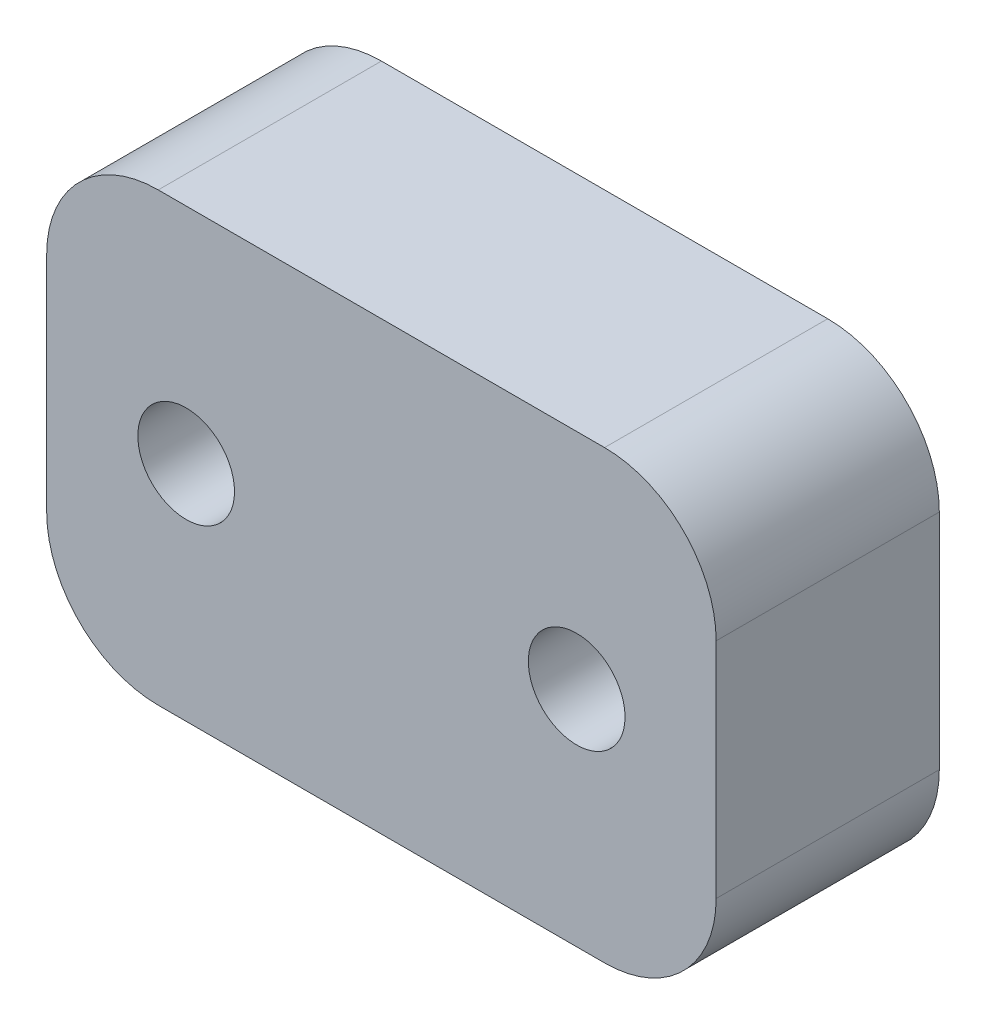
ISO-10303-21;
HEADER;
FILE_DESCRIPTION(('STEP AP214'),'2;1');
FILE_NAME('part.step','',(''),(''),'','','');
FILE_SCHEMA(('AUTOMOTIVE_DESIGN { 1 0 10303 214 1 1 1 1 }'));
ENDSEC;
DATA;
#1=APPLICATION_CONTEXT('core data for automotive mechanical design processes');
#2=APPLICATION_PROTOCOL_DEFINITION('international standard','automotive_design',2000,#1);
#3=PRODUCT_CONTEXT('',#1,'mechanical');
#4=PRODUCT('Part','Part','',(#3));
#5=PRODUCT_RELATED_PRODUCT_CATEGORY('part','',(#4));
#6=PRODUCT_DEFINITION_FORMATION('','',#4);
#7=PRODUCT_DEFINITION_CONTEXT('part definition',#1,'design');
#8=PRODUCT_DEFINITION('design','',#6,#7);
#9=PRODUCT_DEFINITION_SHAPE('','',#8);
#10=(LENGTH_UNIT() NAMED_UNIT(*) SI_UNIT(.MILLI.,.METRE.));
#11=(NAMED_UNIT(*) PLANE_ANGLE_UNIT() SI_UNIT($,.RADIAN.));
#12=(NAMED_UNIT(*) SI_UNIT($,.STERADIAN.) SOLID_ANGLE_UNIT());
#13=UNCERTAINTY_MEASURE_WITH_UNIT(LENGTH_MEASURE(1.E-05),#10,'distance_accuracy_value','');
#14=(GEOMETRIC_REPRESENTATION_CONTEXT(3) GLOBAL_UNCERTAINTY_ASSIGNED_CONTEXT((#13)) GLOBAL_UNIT_ASSIGNED_CONTEXT((#10,
#11,#12)) REPRESENTATION_CONTEXT('',''));
#15=CARTESIAN_POINT('',(0.,0.,0.));
#16=DIRECTION('',(0.,0.,1.));
#17=DIRECTION('',(1.,0.,0.));
#18=AXIS2_PLACEMENT_3D('',#15,#16,#17);
#19=CARTESIAN_POINT('',(0.,0.,6.));
#20=DIRECTION('',(0.,0.,1.));
#21=DIRECTION('',(1.,0.,0.));
#22=AXIS2_PLACEMENT_3D('',#19,#20,#21);
#23=PLANE('',#22);
#24=CARTESIAN_POINT('',(-5.25,0.,6.));
#25=DIRECTION('',(0.,0.,1.));
#26=DIRECTION('',(1.,0.,0.));
#27=AXIS2_PLACEMENT_3D('',#24,#25,#26);
#28=CIRCLE('',#27,1.3);
#29=CARTESIAN_POINT('',(-3.95,0.,6.));
#30=VERTEX_POINT('',#29);
#31=EDGE_CURVE('E143',#30,#30,#28,.T.);
#32=ORIENTED_EDGE('',*,*,#31,.F.);
#33=EDGE_LOOP('',(#32));
#34=FACE_BOUND('',#33,.T.);
#35=DIRECTION('',(0.,-1.,0.));
#36=VECTOR('',#35,1.);
#37=CARTESIAN_POINT('',(-9.,-6.,6.));
#38=LINE('',#37,#36);
#39=CARTESIAN_POINT('',(-9.,3.,6.));
#40=VERTEX_POINT('',#39);
#41=CARTESIAN_POINT('',(-9.,-3.,6.));
#42=VERTEX_POINT('',#41);
#43=EDGE_CURVE('E149',#40,#42,#38,.T.);
#44=ORIENTED_EDGE('',*,*,#43,.T.);
#45=CARTESIAN_POINT('',(-6.,-3.,6.));
#46=DIRECTION('',(0.,0.,1.));
#47=DIRECTION('',(1.,0.,0.));
#48=AXIS2_PLACEMENT_3D('',#45,#46,#47);
#49=CIRCLE('',#48,3.);
#50=CARTESIAN_POINT('',(-6.,-6.,6.));
#51=VERTEX_POINT('',#50);
#52=EDGE_CURVE('E173',#42,#51,#49,.T.);
#53=ORIENTED_EDGE('',*,*,#52,.T.);
#54=DIRECTION('',(1.,0.,0.));
#55=VECTOR('',#54,1.);
#56=CARTESIAN_POINT('',(9.,-6.,6.));
#57=LINE('',#56,#55);
#58=CARTESIAN_POINT('',(6.,-6.,6.));
#59=VERTEX_POINT('',#58);
#60=EDGE_CURVE('E126',#51,#59,#57,.T.);
#61=ORIENTED_EDGE('',*,*,#60,.T.);
#62=CARTESIAN_POINT('',(6.,-3.,6.));
#63=DIRECTION('',(0.,0.,1.));
#64=DIRECTION('',(1.,0.,0.));
#65=AXIS2_PLACEMENT_3D('',#62,#63,#64);
#66=CIRCLE('',#65,3.);
#67=CARTESIAN_POINT('',(9.,-3.,6.));
#68=VERTEX_POINT('',#67);
#69=EDGE_CURVE('E170',#59,#68,#66,.T.);
#70=ORIENTED_EDGE('',*,*,#69,.T.);
#71=DIRECTION('',(0.,1.,0.));
#72=VECTOR('',#71,1.);
#73=CARTESIAN_POINT('',(9.,-6.,6.));
#74=LINE('',#73,#72);
#75=CARTESIAN_POINT('',(9.,3.,6.));
#76=VERTEX_POINT('',#75);
#77=EDGE_CURVE('E199',#68,#76,#74,.T.);
#78=ORIENTED_EDGE('',*,*,#77,.T.);
#79=CARTESIAN_POINT('',(6.,3.,6.));
#80=DIRECTION('',(0.,0.,1.));
#81=DIRECTION('',(1.,0.,0.));
#82=AXIS2_PLACEMENT_3D('',#79,#80,#81);
#83=CIRCLE('',#82,3.);
#84=CARTESIAN_POINT('',(6.,6.,6.));
#85=VERTEX_POINT('',#84);
#86=EDGE_CURVE('E60',#76,#85,#83,.T.);
#87=ORIENTED_EDGE('',*,*,#86,.T.);
#88=DIRECTION('',(-1.,0.,0.));
#89=VECTOR('',#88,1.);
#90=CARTESIAN_POINT('',(9.,6.,6.));
#91=LINE('',#90,#89);
#92=CARTESIAN_POINT('',(-6.,6.,6.));
#93=VERTEX_POINT('',#92);
#94=EDGE_CURVE('E151',#85,#93,#91,.T.);
#95=ORIENTED_EDGE('',*,*,#94,.T.);
#96=CARTESIAN_POINT('',(-6.,3.,6.));
#97=DIRECTION('',(0.,0.,1.));
#98=DIRECTION('',(1.,0.,0.));
#99=AXIS2_PLACEMENT_3D('',#96,#97,#98);
#100=CIRCLE('',#99,3.);
#101=EDGE_CURVE('E167',#93,#40,#100,.T.);
#102=ORIENTED_EDGE('',*,*,#101,.T.);
#103=EDGE_LOOP('',(#44,#53,#61,#70,#78,#87,#95,#102));
#104=FACE_BOUND('',#103,.T.);
#105=CARTESIAN_POINT('',(5.25,0.,6.));
#106=DIRECTION('',(0.,0.,1.));
#107=DIRECTION('',(1.,0.,0.));
#108=AXIS2_PLACEMENT_3D('',#105,#106,#107);
#109=CIRCLE('',#108,1.3);
#110=CARTESIAN_POINT('',(6.55,0.,6.));
#111=VERTEX_POINT('',#110);
#112=EDGE_CURVE('E213',#111,#111,#109,.T.);
#113=ORIENTED_EDGE('',*,*,#112,.F.);
#114=EDGE_LOOP('',(#113));
#115=FACE_BOUND('',#114,.T.);
#116=ADVANCED_FACE('F39',(#34,#104,#115),#23,.T.);
#117=CARTESIAN_POINT('',(0.,0.,0.));
#118=DIRECTION('',(0.,0.,1.));
#119=DIRECTION('',(1.,0.,0.));
#120=AXIS2_PLACEMENT_3D('',#117,#118,#119);
#121=PLANE('',#120);
#122=DIRECTION('',(1.,0.,0.));
#123=VECTOR('',#122,1.);
#124=CARTESIAN_POINT('',(9.,-6.,0.));
#125=LINE('',#124,#123);
#126=CARTESIAN_POINT('',(-6.,-6.,0.));
#127=VERTEX_POINT('',#126);
#128=CARTESIAN_POINT('',(6.,-6.,0.));
#129=VERTEX_POINT('',#128);
#130=EDGE_CURVE('E123',#127,#129,#125,.T.);
#131=ORIENTED_EDGE('',*,*,#130,.F.);
#132=CARTESIAN_POINT('',(-6.,-3.,0.));
#133=DIRECTION('',(0.,0.,1.));
#134=DIRECTION('',(1.,0.,0.));
#135=AXIS2_PLACEMENT_3D('',#132,#133,#134);
#136=CIRCLE('',#135,3.);
#137=CARTESIAN_POINT('',(-9.,-3.,0.));
#138=VERTEX_POINT('',#137);
#139=EDGE_CURVE('E105',#127,#138,#136,.F.);
#140=ORIENTED_EDGE('',*,*,#139,.T.);
#141=DIRECTION('',(0.,-1.,0.));
#142=VECTOR('',#141,1.);
#143=CARTESIAN_POINT('',(-9.,-6.,0.));
#144=LINE('',#143,#142);
#145=CARTESIAN_POINT('',(-9.,3.,0.));
#146=VERTEX_POINT('',#145);
#147=EDGE_CURVE('E136',#146,#138,#144,.T.);
#148=ORIENTED_EDGE('',*,*,#147,.F.);
#149=CARTESIAN_POINT('',(-6.,3.,0.));
#150=DIRECTION('',(0.,0.,1.));
#151=DIRECTION('',(1.,0.,0.));
#152=AXIS2_PLACEMENT_3D('',#149,#150,#151);
#153=CIRCLE('',#152,3.);
#154=CARTESIAN_POINT('',(-6.,6.,0.));
#155=VERTEX_POINT('',#154);
#156=EDGE_CURVE('E155',#146,#155,#153,.F.);
#157=ORIENTED_EDGE('',*,*,#156,.T.);
#158=DIRECTION('',(-1.,0.,0.));
#159=VECTOR('',#158,1.);
#160=CARTESIAN_POINT('',(9.,6.,0.));
#161=LINE('',#160,#159);
#162=CARTESIAN_POINT('',(6.,6.,0.));
#163=VERTEX_POINT('',#162);
#164=EDGE_CURVE('E141',#163,#155,#161,.T.);
#165=ORIENTED_EDGE('',*,*,#164,.F.);
#166=CARTESIAN_POINT('',(6.,3.,0.));
#167=DIRECTION('',(0.,0.,1.));
#168=DIRECTION('',(1.,0.,0.));
#169=AXIS2_PLACEMENT_3D('',#166,#167,#168);
#170=CIRCLE('',#169,3.);
#171=CARTESIAN_POINT('',(9.,3.,0.));
#172=VERTEX_POINT('',#171);
#173=EDGE_CURVE('E128',#163,#172,#170,.F.);
#174=ORIENTED_EDGE('',*,*,#173,.T.);
#175=DIRECTION('',(0.,1.,0.));
#176=VECTOR('',#175,1.);
#177=CARTESIAN_POINT('',(9.,-6.,0.));
#178=LINE('',#177,#176);
#179=CARTESIAN_POINT('',(9.,-3.,0.));
#180=VERTEX_POINT('',#179);
#181=EDGE_CURVE('E135',#180,#172,#178,.T.);
#182=ORIENTED_EDGE('',*,*,#181,.F.);
#183=CARTESIAN_POINT('',(6.,-3.,0.));
#184=DIRECTION('',(0.,0.,1.));
#185=DIRECTION('',(1.,0.,0.));
#186=AXIS2_PLACEMENT_3D('',#183,#184,#185);
#187=CIRCLE('',#186,3.);
#188=EDGE_CURVE('E117',#180,#129,#187,.F.);
#189=ORIENTED_EDGE('',*,*,#188,.T.);
#190=EDGE_LOOP('',(#131,#140,#148,#157,#165,#174,#182,#189));
#191=FACE_BOUND('',#190,.T.);
#192=CARTESIAN_POINT('',(-5.25,0.,0.));
#193=DIRECTION('',(0.,0.,1.));
#194=DIRECTION('',(1.,0.,0.));
#195=AXIS2_PLACEMENT_3D('',#192,#193,#194);
#196=CIRCLE('',#195,1.3);
#197=CARTESIAN_POINT('',(-3.95,0.,0.));
#198=VERTEX_POINT('',#197);
#199=EDGE_CURVE('E202',#198,#198,#196,.T.);
#200=ORIENTED_EDGE('',*,*,#199,.T.);
#201=EDGE_LOOP('',(#200));
#202=FACE_BOUND('',#201,.T.);
#203=CARTESIAN_POINT('',(5.25,0.,0.));
#204=DIRECTION('',(0.,0.,1.));
#205=DIRECTION('',(1.,0.,0.));
#206=AXIS2_PLACEMENT_3D('',#203,#204,#205);
#207=CIRCLE('',#206,1.3);
#208=CARTESIAN_POINT('',(6.55,0.,0.));
#209=VERTEX_POINT('',#208);
#210=EDGE_CURVE('E216',#209,#209,#207,.T.);
#211=ORIENTED_EDGE('',*,*,#210,.T.);
#212=EDGE_LOOP('',(#211));
#213=FACE_BOUND('',#212,.T.);
#214=ADVANCED_FACE('F131',(#191,#202,#213),#121,.F.);
#215=CARTESIAN_POINT('',(-9.,-6.,6.));
#216=DIRECTION('',(1.,0.,0.));
#217=DIRECTION('',(0.,1.,0.));
#218=AXIS2_PLACEMENT_3D('',#215,#216,#217);
#219=PLANE('',#218);
#220=ORIENTED_EDGE('',*,*,#147,.T.);
#221=DIRECTION('',(0.,0.,-1.));
#222=VECTOR('',#221,1.);
#223=CARTESIAN_POINT('',(-9.,-3.,6.));
#224=LINE('',#223,#222);
#225=EDGE_CURVE('E110',#138,#42,#224,.F.);
#226=ORIENTED_EDGE('',*,*,#225,.T.);
#227=ORIENTED_EDGE('',*,*,#43,.F.);
#228=DIRECTION('',(0.,0.,-1.));
#229=VECTOR('',#228,1.);
#230=CARTESIAN_POINT('',(-9.,3.,6.));
#231=LINE('',#230,#229);
#232=EDGE_CURVE('E116',#40,#146,#231,.T.);
#233=ORIENTED_EDGE('',*,*,#232,.T.);
#234=EDGE_LOOP('',(#220,#226,#227,#233));
#235=FACE_BOUND('',#234,.T.);
#236=ADVANCED_FACE('F194',(#235),#219,.F.);
#237=CARTESIAN_POINT('',(9.,-6.,6.));
#238=DIRECTION('',(0.,1.,0.));
#239=DIRECTION('',(-1.,0.,0.));
#240=AXIS2_PLACEMENT_3D('',#237,#238,#239);
#241=PLANE('',#240);
#242=ORIENTED_EDGE('',*,*,#60,.F.);
#243=DIRECTION('',(0.,0.,-1.));
#244=VECTOR('',#243,1.);
#245=CARTESIAN_POINT('',(-6.,-6.,6.));
#246=LINE('',#245,#244);
#247=EDGE_CURVE('E109',#51,#127,#246,.T.);
#248=ORIENTED_EDGE('',*,*,#247,.T.);
#249=ORIENTED_EDGE('',*,*,#130,.T.);
#250=DIRECTION('',(0.,0.,-1.));
#251=VECTOR('',#250,1.);
#252=CARTESIAN_POINT('',(6.,-6.,6.));
#253=LINE('',#252,#251);
#254=EDGE_CURVE('E129',#129,#59,#253,.F.);
#255=ORIENTED_EDGE('',*,*,#254,.T.);
#256=EDGE_LOOP('',(#242,#248,#249,#255));
#257=FACE_BOUND('',#256,.T.);
#258=ADVANCED_FACE('F122',(#257),#241,.F.);
#259=CARTESIAN_POINT('',(9.,-6.,6.));
#260=DIRECTION('',(-1.,0.,0.));
#261=DIRECTION('',(0.,0.,1.));
#262=AXIS2_PLACEMENT_3D('',#259,#260,#261);
#263=PLANE('',#262);
#264=ORIENTED_EDGE('',*,*,#77,.F.);
#265=DIRECTION('',(0.,0.,-1.));
#266=VECTOR('',#265,1.);
#267=CARTESIAN_POINT('',(9.,-3.,6.));
#268=LINE('',#267,#266);
#269=EDGE_CURVE('E179',#68,#180,#268,.T.);
#270=ORIENTED_EDGE('',*,*,#269,.T.);
#271=ORIENTED_EDGE('',*,*,#181,.T.);
#272=DIRECTION('',(0.,0.,-1.));
#273=VECTOR('',#272,1.);
#274=CARTESIAN_POINT('',(9.,3.,6.));
#275=LINE('',#274,#273);
#276=EDGE_CURVE('E176',#172,#76,#275,.F.);
#277=ORIENTED_EDGE('',*,*,#276,.T.);
#278=EDGE_LOOP('',(#264,#270,#271,#277));
#279=FACE_BOUND('',#278,.T.);
#280=ADVANCED_FACE('F248',(#279),#263,.F.);
#281=CARTESIAN_POINT('',(9.,6.,6.));
#282=DIRECTION('',(0.,-1.,0.));
#283=DIRECTION('',(1.,0.,0.));
#284=AXIS2_PLACEMENT_3D('',#281,#282,#283);
#285=PLANE('',#284);
#286=ORIENTED_EDGE('',*,*,#164,.T.);
#287=DIRECTION('',(0.,0.,-1.));
#288=VECTOR('',#287,1.);
#289=CARTESIAN_POINT('',(-6.,6.,6.));
#290=LINE('',#289,#288);
#291=EDGE_CURVE('E11',#155,#93,#290,.F.);
#292=ORIENTED_EDGE('',*,*,#291,.T.);
#293=ORIENTED_EDGE('',*,*,#94,.F.);
#294=DIRECTION('',(0.,0.,-1.));
#295=VECTOR('',#294,1.);
#296=CARTESIAN_POINT('',(6.,6.,6.));
#297=LINE('',#296,#295);
#298=EDGE_CURVE('E48',#85,#163,#297,.T.);
#299=ORIENTED_EDGE('',*,*,#298,.T.);
#300=EDGE_LOOP('',(#286,#292,#293,#299));
#301=FACE_BOUND('',#300,.T.);
#302=ADVANCED_FACE('F186',(#301),#285,.F.);
#303=CARTESIAN_POINT('',(-5.25,0.,6.));
#304=DIRECTION('',(0.,0.,-1.));
#305=DIRECTION('',(-1.,0.,0.));
#306=AXIS2_PLACEMENT_3D('',#303,#304,#305);
#307=CYLINDRICAL_SURFACE('',#306,1.3);
#308=ORIENTED_EDGE('',*,*,#31,.T.);
#309=EDGE_LOOP('',(#308));
#310=FACE_BOUND('',#309,.T.);
#311=ORIENTED_EDGE('',*,*,#199,.F.);
#312=EDGE_LOOP('',(#311));
#313=FACE_BOUND('',#312,.T.);
#314=ADVANCED_FACE('F227',(#310,#313),#307,.F.);
#315=CARTESIAN_POINT('',(5.25,0.,6.));
#316=DIRECTION('',(0.,0.,-1.));
#317=DIRECTION('',(-1.,0.,0.));
#318=AXIS2_PLACEMENT_3D('',#315,#316,#317);
#319=CYLINDRICAL_SURFACE('',#318,1.3);
#320=ORIENTED_EDGE('',*,*,#112,.T.);
#321=EDGE_LOOP('',(#320));
#322=FACE_BOUND('',#321,.T.);
#323=ORIENTED_EDGE('',*,*,#210,.F.);
#324=EDGE_LOOP('',(#323));
#325=FACE_BOUND('',#324,.T.);
#326=ADVANCED_FACE('F230',(#322,#325),#319,.F.);
#327=CARTESIAN_POINT('',(-6.,-3.,6.));
#328=DIRECTION('',(0.,0.,-1.));
#329=DIRECTION('',(-1.,0.,0.));
#330=AXIS2_PLACEMENT_3D('',#327,#328,#329);
#331=CYLINDRICAL_SURFACE('',#330,3.);
#332=ORIENTED_EDGE('',*,*,#52,.F.);
#333=ORIENTED_EDGE('',*,*,#225,.F.);
#334=ORIENTED_EDGE('',*,*,#139,.F.);
#335=ORIENTED_EDGE('',*,*,#247,.F.);
#336=EDGE_LOOP('',(#332,#333,#334,#335));
#337=FACE_BOUND('',#336,.T.);
#338=ADVANCED_FACE('F108',(#337),#331,.T.);
#339=CARTESIAN_POINT('',(6.,-3.,6.));
#340=DIRECTION('',(0.,0.,-1.));
#341=DIRECTION('',(-1.,0.,0.));
#342=AXIS2_PLACEMENT_3D('',#339,#340,#341);
#343=CYLINDRICAL_SURFACE('',#342,3.);
#344=ORIENTED_EDGE('',*,*,#69,.F.);
#345=ORIENTED_EDGE('',*,*,#254,.F.);
#346=ORIENTED_EDGE('',*,*,#188,.F.);
#347=ORIENTED_EDGE('',*,*,#269,.F.);
#348=EDGE_LOOP('',(#344,#345,#346,#347));
#349=FACE_BOUND('',#348,.T.);
#350=ADVANCED_FACE('F243',(#349),#343,.T.);
#351=CARTESIAN_POINT('',(-6.,3.,6.));
#352=DIRECTION('',(0.,0.,-1.));
#353=DIRECTION('',(-1.,0.,0.));
#354=AXIS2_PLACEMENT_3D('',#351,#352,#353);
#355=CYLINDRICAL_SURFACE('',#354,3.);
#356=ORIENTED_EDGE('',*,*,#101,.F.);
#357=ORIENTED_EDGE('',*,*,#291,.F.);
#358=ORIENTED_EDGE('',*,*,#156,.F.);
#359=ORIENTED_EDGE('',*,*,#232,.F.);
#360=EDGE_LOOP('',(#356,#357,#358,#359));
#361=FACE_BOUND('',#360,.T.);
#362=ADVANCED_FACE('F191',(#361),#355,.T.);
#363=CARTESIAN_POINT('',(6.,3.,6.));
#364=DIRECTION('',(0.,0.,-1.));
#365=DIRECTION('',(-1.,0.,0.));
#366=AXIS2_PLACEMENT_3D('',#363,#364,#365);
#367=CYLINDRICAL_SURFACE('',#366,3.);
#368=ORIENTED_EDGE('',*,*,#86,.F.);
#369=ORIENTED_EDGE('',*,*,#276,.F.);
#370=ORIENTED_EDGE('',*,*,#173,.F.);
#371=ORIENTED_EDGE('',*,*,#298,.F.);
#372=EDGE_LOOP('',(#368,#369,#370,#371));
#373=FACE_BOUND('',#372,.T.);
#374=ADVANCED_FACE('F41',(#373),#367,.T.);
#375=CLOSED_SHELL('',(#116,#214,#236,#258,#280,#302,#314,#326,#338,#350,#362,#374));
#376=MANIFOLD_SOLID_BREP('B2',#375);
#377=ADVANCED_BREP_SHAPE_REPRESENTATION('',(#18,#376),#14);
#378=SHAPE_DEFINITION_REPRESENTATION(#9,#377);
ENDSEC;
END-ISO-10303-21;
